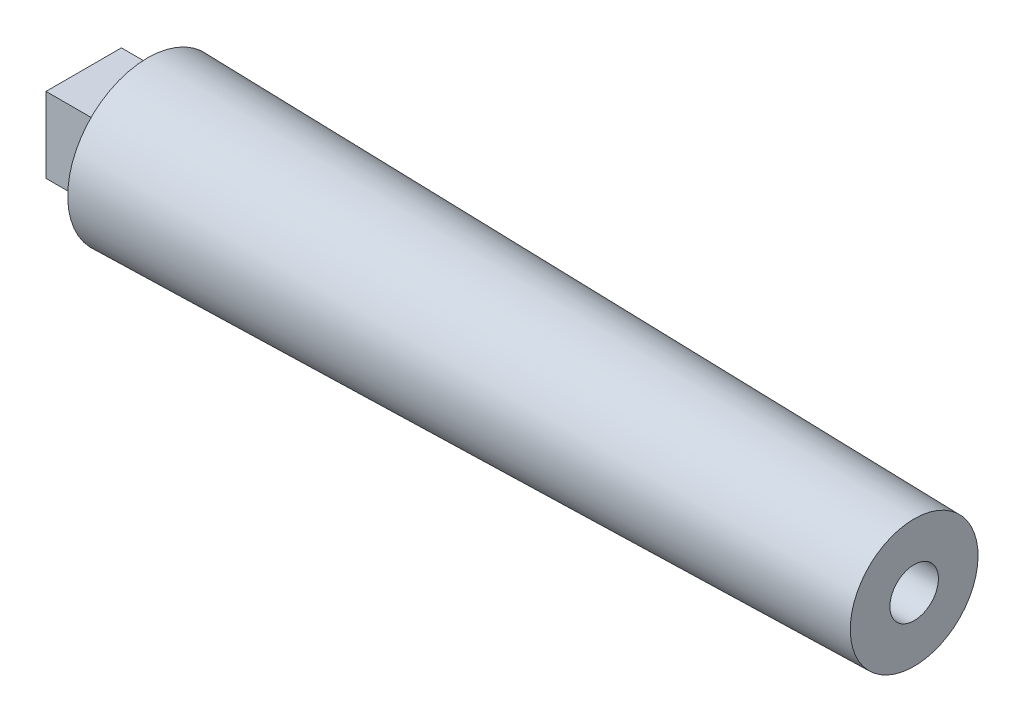
ISO-10303-21;
HEADER;
FILE_DESCRIPTION(('STEP AP214'),'2;1');
FILE_NAME('part.step','',(''),(''),'','','');
FILE_SCHEMA(('AUTOMOTIVE_DESIGN { 1 0 10303 214 1 1 1 1 }'));
ENDSEC;
DATA;
#1=APPLICATION_CONTEXT('core data for automotive mechanical design processes');
#2=APPLICATION_PROTOCOL_DEFINITION('international standard','automotive_design',2000,#1);
#3=PRODUCT_CONTEXT('',#1,'mechanical');
#4=PRODUCT('Part','Part','',(#3));
#5=PRODUCT_RELATED_PRODUCT_CATEGORY('part','',(#4));
#6=PRODUCT_DEFINITION_FORMATION('','',#4);
#7=PRODUCT_DEFINITION_CONTEXT('part definition',#1,'design');
#8=PRODUCT_DEFINITION('design','',#6,#7);
#9=PRODUCT_DEFINITION_SHAPE('','',#8);
#10=(LENGTH_UNIT() NAMED_UNIT(*) SI_UNIT(.MILLI.,.METRE.));
#11=(NAMED_UNIT(*) PLANE_ANGLE_UNIT() SI_UNIT($,.RADIAN.));
#12=(NAMED_UNIT(*) SI_UNIT($,.STERADIAN.) SOLID_ANGLE_UNIT());
#13=UNCERTAINTY_MEASURE_WITH_UNIT(LENGTH_MEASURE(1.E-05),#10,'distance_accuracy_value','');
#14=(GEOMETRIC_REPRESENTATION_CONTEXT(3) GLOBAL_UNCERTAINTY_ASSIGNED_CONTEXT((#13)) GLOBAL_UNIT_ASSIGNED_CONTEXT((#10,
#11,#12)) REPRESENTATION_CONTEXT('',''));
#15=CARTESIAN_POINT('',(0.,0.,0.));
#16=DIRECTION('',(0.,0.,1.));
#17=DIRECTION('',(1.,0.,0.));
#18=AXIS2_PLACEMENT_3D('',#15,#16,#17);
#19=CARTESIAN_POINT('',(0.,0.,0.));
#20=DIRECTION('',(-1.,0.,0.));
#21=DIRECTION('',(0.,-1.,0.));
#22=AXIS2_PLACEMENT_3D('',#19,#20,#21);
#23=CONICAL_SURFACE('',#22,12.7,0.0208303200362171);
#24=CARTESIAN_POINT('',(-152.4,0.,0.));
#25=DIRECTION('',(1.,0.,0.));
#26=DIRECTION('',(0.,1.,0.));
#27=AXIS2_PLACEMENT_3D('',#24,#25,#26);
#28=CIRCLE('',#27,15.875);
#29=CARTESIAN_POINT('',(-152.4,15.875,0.));
#30=VERTEX_POINT('',#29);
#31=EDGE_CURVE('E40',#30,#30,#28,.T.);
#32=ORIENTED_EDGE('',*,*,#31,.T.);
#33=EDGE_LOOP('',(#32));
#34=FACE_BOUND('',#33,.T.);
#35=CARTESIAN_POINT('',(0.,0.,0.));
#36=DIRECTION('',(1.,0.,0.));
#37=DIRECTION('',(0.,1.,0.));
#38=AXIS2_PLACEMENT_3D('',#35,#36,#37);
#39=CIRCLE('',#38,12.7);
#40=CARTESIAN_POINT('',(0.,12.7,0.));
#41=VERTEX_POINT('',#40);
#42=EDGE_CURVE('E11',#41,#41,#39,.T.);
#43=ORIENTED_EDGE('',*,*,#42,.F.);
#44=EDGE_LOOP('',(#43));
#45=FACE_BOUND('',#44,.T.);
#46=ADVANCED_FACE('F33',(#34,#45),#23,.T.);
#47=CARTESIAN_POINT('',(0.,12.7,0.));
#48=DIRECTION('',(1.,0.,0.));
#49=DIRECTION('',(0.,1.,0.));
#50=AXIS2_PLACEMENT_3D('',#47,#48,#49);
#51=PLANE('',#50);
#52=CARTESIAN_POINT('',(0.,0.,0.));
#53=DIRECTION('',(1.,0.,0.));
#54=DIRECTION('',(0.,1.,0.));
#55=AXIS2_PLACEMENT_3D('',#52,#53,#54);
#56=CIRCLE('',#55,4.826);
#57=CARTESIAN_POINT('',(0.,4.826,0.));
#58=VERTEX_POINT('',#57);
#59=EDGE_CURVE('E111',#58,#58,#56,.T.);
#60=ORIENTED_EDGE('',*,*,#59,.F.);
#61=EDGE_LOOP('',(#60));
#62=FACE_BOUND('',#61,.T.);
#63=ORIENTED_EDGE('',*,*,#42,.T.);
#64=EDGE_LOOP('',(#63));
#65=FACE_BOUND('',#64,.T.);
#66=ADVANCED_FACE('F125',(#62,#65),#51,.T.);
#67=CARTESIAN_POINT('',(-152.4,0.,0.));
#68=DIRECTION('',(-1.,0.,0.));
#69=DIRECTION('',(0.,-1.,0.));
#70=AXIS2_PLACEMENT_3D('',#67,#68,#69);
#71=PLANE('',#70);
#72=DIRECTION('',(0.,1.,0.));
#73=VECTOR('',#72,1.);
#74=CARTESIAN_POINT('',(-152.4,-7.49300000000002,7.493));
#75=LINE('',#74,#73);
#76=CARTESIAN_POINT('',(-152.4,-7.49300000000002,7.493));
#77=VERTEX_POINT('',#76);
#78=CARTESIAN_POINT('',(-152.4,7.49299999999998,7.493));
#79=VERTEX_POINT('',#78);
#80=EDGE_CURVE('E47',#77,#79,#75,.T.);
#81=ORIENTED_EDGE('',*,*,#80,.F.);
#82=DIRECTION('',(0.,0.,1.));
#83=VECTOR('',#82,1.);
#84=CARTESIAN_POINT('',(-152.4,-7.49300000000002,-7.493));
#85=LINE('',#84,#83);
#86=CARTESIAN_POINT('',(-152.4,-7.49300000000002,-7.493));
#87=VERTEX_POINT('',#86);
#88=EDGE_CURVE('E51',#87,#77,#85,.T.);
#89=ORIENTED_EDGE('',*,*,#88,.F.);
#90=DIRECTION('',(0.,-1.,0.));
#91=VECTOR('',#90,1.);
#92=CARTESIAN_POINT('',(-152.4,-7.49300000000002,-7.493));
#93=LINE('',#92,#91);
#94=CARTESIAN_POINT('',(-152.4,7.49299999999998,-7.493));
#95=VERTEX_POINT('',#94);
#96=EDGE_CURVE('E103',#95,#87,#93,.T.);
#97=ORIENTED_EDGE('',*,*,#96,.F.);
#98=DIRECTION('',(0.,0.,-1.));
#99=VECTOR('',#98,1.);
#100=CARTESIAN_POINT('',(-152.4,7.49299999999998,-7.493));
#101=LINE('',#100,#99);
#102=EDGE_CURVE('E105',#79,#95,#101,.T.);
#103=ORIENTED_EDGE('',*,*,#102,.F.);
#104=EDGE_LOOP('',(#81,#89,#97,#103));
#105=FACE_BOUND('',#104,.T.);
#106=ORIENTED_EDGE('',*,*,#31,.F.);
#107=EDGE_LOOP('',(#106));
#108=FACE_BOUND('',#107,.T.);
#109=ADVANCED_FACE('F128',(#105,#108),#71,.T.);
#110=CARTESIAN_POINT('',(-165.1,-7.49300000000002,7.493));
#111=DIRECTION('',(0.,0.,-1.));
#112=DIRECTION('',(-1.,0.,0.));
#113=AXIS2_PLACEMENT_3D('',#110,#111,#112);
#114=PLANE('',#113);
#115=ORIENTED_EDGE('',*,*,#80,.T.);
#116=DIRECTION('',(1.,0.,0.));
#117=VECTOR('',#116,1.);
#118=CARTESIAN_POINT('',(-165.1,7.49299999999998,7.493));
#119=LINE('',#118,#117);
#120=CARTESIAN_POINT('',(-165.1,7.49299999999998,7.493));
#121=VERTEX_POINT('',#120);
#122=EDGE_CURVE('E76',#121,#79,#119,.T.);
#123=ORIENTED_EDGE('',*,*,#122,.F.);
#124=DIRECTION('',(0.,1.,0.));
#125=VECTOR('',#124,1.);
#126=CARTESIAN_POINT('',(-165.1,-7.49300000000002,7.493));
#127=LINE('',#126,#125);
#128=CARTESIAN_POINT('',(-165.1,-7.49300000000002,7.493));
#129=VERTEX_POINT('',#128);
#130=EDGE_CURVE('E82',#129,#121,#127,.T.);
#131=ORIENTED_EDGE('',*,*,#130,.F.);
#132=DIRECTION('',(1.,0.,0.));
#133=VECTOR('',#132,1.);
#134=CARTESIAN_POINT('',(-165.1,-7.49300000000002,7.493));
#135=LINE('',#134,#133);
#136=EDGE_CURVE('E100',#129,#77,#135,.T.);
#137=ORIENTED_EDGE('',*,*,#136,.T.);
#138=EDGE_LOOP('',(#115,#123,#131,#137));
#139=FACE_BOUND('',#138,.T.);
#140=ADVANCED_FACE('F92',(#139),#114,.F.);
#141=CARTESIAN_POINT('',(-165.1,7.49299999999998,-7.493));
#142=DIRECTION('',(0.,-1.,0.));
#143=DIRECTION('',(1.,0.,0.));
#144=AXIS2_PLACEMENT_3D('',#141,#142,#143);
#145=PLANE('',#144);
#146=ORIENTED_EDGE('',*,*,#102,.T.);
#147=DIRECTION('',(1.,0.,0.));
#148=VECTOR('',#147,1.);
#149=CARTESIAN_POINT('',(-165.1,7.49299999999998,-7.493));
#150=LINE('',#149,#148);
#151=CARTESIAN_POINT('',(-165.1,7.49299999999998,-7.493));
#152=VERTEX_POINT('',#151);
#153=EDGE_CURVE('E78',#152,#95,#150,.T.);
#154=ORIENTED_EDGE('',*,*,#153,.F.);
#155=DIRECTION('',(0.,0.,-1.));
#156=VECTOR('',#155,1.);
#157=CARTESIAN_POINT('',(-165.1,7.49299999999998,-7.493));
#158=LINE('',#157,#156);
#159=EDGE_CURVE('E71',#121,#152,#158,.T.);
#160=ORIENTED_EDGE('',*,*,#159,.F.);
#161=ORIENTED_EDGE('',*,*,#122,.T.);
#162=EDGE_LOOP('',(#146,#154,#160,#161));
#163=FACE_BOUND('',#162,.T.);
#164=ADVANCED_FACE('F74',(#163),#145,.F.);
#165=CARTESIAN_POINT('',(-165.1,-7.49300000000002,-7.493));
#166=DIRECTION('',(0.,0.,1.));
#167=DIRECTION('',(1.,0.,0.));
#168=AXIS2_PLACEMENT_3D('',#165,#166,#167);
#169=PLANE('',#168);
#170=ORIENTED_EDGE('',*,*,#96,.T.);
#171=DIRECTION('',(1.,0.,0.));
#172=VECTOR('',#171,1.);
#173=CARTESIAN_POINT('',(-165.1,-7.49300000000002,-7.493));
#174=LINE('',#173,#172);
#175=CARTESIAN_POINT('',(-165.1,-7.49300000000002,-7.493));
#176=VERTEX_POINT('',#175);
#177=EDGE_CURVE('E95',#176,#87,#174,.T.);
#178=ORIENTED_EDGE('',*,*,#177,.F.);
#179=DIRECTION('',(0.,-1.,0.));
#180=VECTOR('',#179,1.);
#181=CARTESIAN_POINT('',(-165.1,-7.49300000000002,-7.493));
#182=LINE('',#181,#180);
#183=EDGE_CURVE('E81',#152,#176,#182,.T.);
#184=ORIENTED_EDGE('',*,*,#183,.F.);
#185=ORIENTED_EDGE('',*,*,#153,.T.);
#186=EDGE_LOOP('',(#170,#178,#184,#185));
#187=FACE_BOUND('',#186,.T.);
#188=ADVANCED_FACE('F146',(#187),#169,.F.);
#189=CARTESIAN_POINT('',(-165.1,-7.49300000000002,-7.493));
#190=DIRECTION('',(0.,1.,0.));
#191=DIRECTION('',(-1.,0.,0.));
#192=AXIS2_PLACEMENT_3D('',#189,#190,#191);
#193=PLANE('',#192);
#194=ORIENTED_EDGE('',*,*,#88,.T.);
#195=ORIENTED_EDGE('',*,*,#136,.F.);
#196=DIRECTION('',(0.,0.,1.));
#197=VECTOR('',#196,1.);
#198=CARTESIAN_POINT('',(-165.1,-7.49300000000002,-7.493));
#199=LINE('',#198,#197);
#200=EDGE_CURVE('E87',#176,#129,#199,.T.);
#201=ORIENTED_EDGE('',*,*,#200,.F.);
#202=ORIENTED_EDGE('',*,*,#177,.T.);
#203=EDGE_LOOP('',(#194,#195,#201,#202));
#204=FACE_BOUND('',#203,.T.);
#205=ADVANCED_FACE('F149',(#204),#193,.F.);
#206=CARTESIAN_POINT('',(-165.1,0.,0.));
#207=DIRECTION('',(1.,0.,0.));
#208=DIRECTION('',(0.,0.,-1.));
#209=AXIS2_PLACEMENT_3D('',#206,#207,#208);
#210=PLANE('',#209);
#211=ORIENTED_EDGE('',*,*,#130,.T.);
#212=ORIENTED_EDGE('',*,*,#159,.T.);
#213=ORIENTED_EDGE('',*,*,#183,.T.);
#214=ORIENTED_EDGE('',*,*,#200,.T.);
#215=EDGE_LOOP('',(#211,#212,#213,#214));
#216=FACE_BOUND('',#215,.T.);
#217=ADVANCED_FACE('F85',(#216),#210,.F.);
#218=CARTESIAN_POINT('',(-25.4,0.,0.));
#219=DIRECTION('',(1.,0.,0.));
#220=DIRECTION('',(0.,1.,0.));
#221=AXIS2_PLACEMENT_3D('',#218,#219,#220);
#222=CYLINDRICAL_SURFACE('',#221,4.826);
#223=CARTESIAN_POINT('',(-25.4,0.,0.));
#224=DIRECTION('',(1.,0.,0.));
#225=DIRECTION('',(0.,1.,0.));
#226=AXIS2_PLACEMENT_3D('',#223,#224,#225);
#227=CIRCLE('',#226,4.826);
#228=CARTESIAN_POINT('',(-25.4,4.826,0.));
#229=VERTEX_POINT('',#228);
#230=EDGE_CURVE('E108',#229,#229,#227,.T.);
#231=ORIENTED_EDGE('',*,*,#230,.F.);
#232=EDGE_LOOP('',(#231));
#233=FACE_BOUND('',#232,.T.);
#234=ORIENTED_EDGE('',*,*,#59,.T.);
#235=EDGE_LOOP('',(#234));
#236=FACE_BOUND('',#235,.T.);
#237=ADVANCED_FACE('F119',(#233,#236),#222,.F.);
#238=CARTESIAN_POINT('',(-25.4,0.,0.));
#239=DIRECTION('',(1.,0.,0.));
#240=DIRECTION('',(0.,1.,0.));
#241=AXIS2_PLACEMENT_3D('',#238,#239,#240);
#242=PLANE('',#241);
#243=ORIENTED_EDGE('',*,*,#230,.T.);
#244=EDGE_LOOP('',(#243));
#245=FACE_BOUND('',#244,.T.);
#246=ADVANCED_FACE('F117',(#245),#242,.T.);
#247=CLOSED_SHELL('',(#46,#66,#109,#140,#164,#188,#205,#217,#237,#246));
#248=MANIFOLD_SOLID_BREP('B2',#247);
#249=ADVANCED_BREP_SHAPE_REPRESENTATION('',(#18,#248),#14);
#250=SHAPE_DEFINITION_REPRESENTATION(#9,#249);
ENDSEC;
END-ISO-10303-21;
